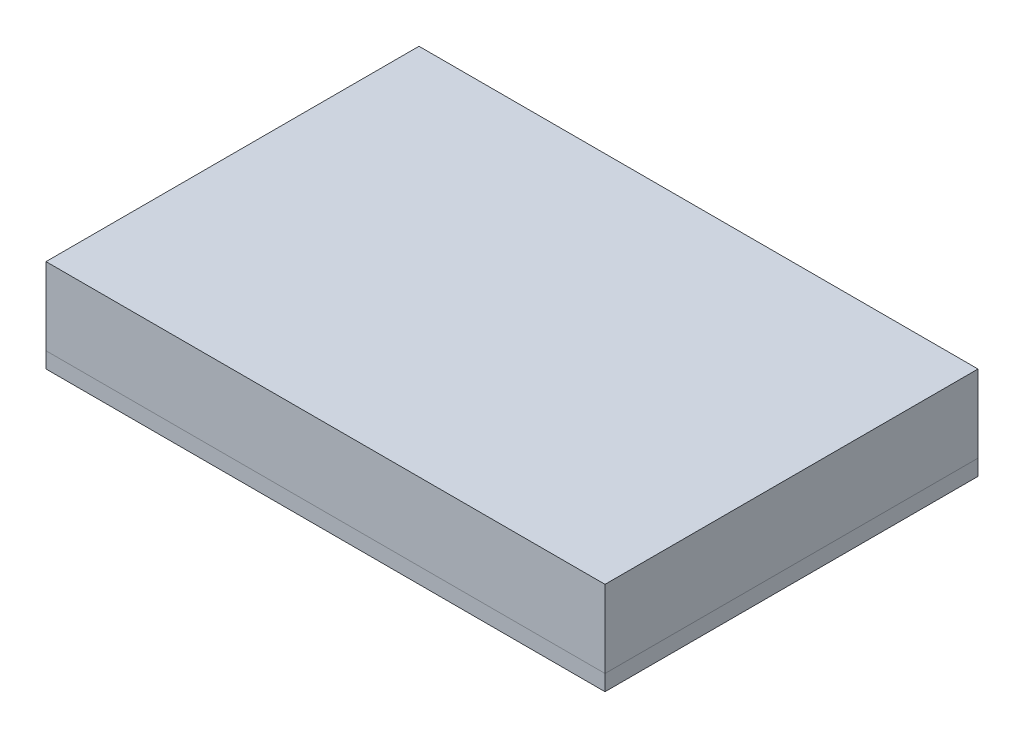
ISO-10303-21;
HEADER;
FILE_DESCRIPTION(('STEP AP214'),'2;1');
FILE_NAME('part.step','',(''),(''),'','','');
FILE_SCHEMA(('AUTOMOTIVE_DESIGN { 1 0 10303 214 1 1 1 1 }'));
ENDSEC;
DATA;
#1=APPLICATION_CONTEXT('core data for automotive mechanical design processes');
#2=APPLICATION_PROTOCOL_DEFINITION('international standard','automotive_design',2000,#1);
#3=PRODUCT_CONTEXT('',#1,'mechanical');
#4=PRODUCT('Part','Part','',(#3));
#5=PRODUCT_RELATED_PRODUCT_CATEGORY('part','',(#4));
#6=PRODUCT_DEFINITION_FORMATION('','',#4);
#7=PRODUCT_DEFINITION_CONTEXT('part definition',#1,'design');
#8=PRODUCT_DEFINITION('design','',#6,#7);
#9=PRODUCT_DEFINITION_SHAPE('','',#8);
#10=(LENGTH_UNIT() NAMED_UNIT(*) SI_UNIT(.MILLI.,.METRE.));
#11=(NAMED_UNIT(*) PLANE_ANGLE_UNIT() SI_UNIT($,.RADIAN.));
#12=(NAMED_UNIT(*) SI_UNIT($,.STERADIAN.) SOLID_ANGLE_UNIT());
#13=UNCERTAINTY_MEASURE_WITH_UNIT(LENGTH_MEASURE(1.E-05),#10,'distance_accuracy_value','');
#14=(GEOMETRIC_REPRESENTATION_CONTEXT(3) GLOBAL_UNCERTAINTY_ASSIGNED_CONTEXT((#13)) GLOBAL_UNIT_ASSIGNED_CONTEXT((#10,
#11,#12)) REPRESENTATION_CONTEXT('',''));
#15=CARTESIAN_POINT('',(0.,0.,0.));
#16=DIRECTION('',(0.,0.,1.));
#17=DIRECTION('',(1.,0.,0.));
#18=AXIS2_PLACEMENT_3D('',#15,#16,#17);
#19=CARTESIAN_POINT('',(0.,10.,-40.1));
#20=DIRECTION('',(0.,0.,1.));
#21=DIRECTION('',(1.,0.,0.));
#22=AXIS2_PLACEMENT_3D('',#19,#20,#21);
#23=PLANE('',#22);
#24=DIRECTION('',(-1.,0.,0.));
#25=VECTOR('',#24,1.);
#26=CARTESIAN_POINT('',(0.,1.7,-40.1));
#27=LINE('',#26,#25);
#28=CARTESIAN_POINT('',(60.1,1.7,-40.1));
#29=VERTEX_POINT('',#28);
#30=CARTESIAN_POINT('',(0.,1.7,-40.1));
#31=VERTEX_POINT('',#30);
#32=EDGE_CURVE('E109',#29,#31,#27,.T.);
#33=ORIENTED_EDGE('',*,*,#32,.T.);
#34=DIRECTION('',(0.,-1.,0.));
#35=VECTOR('',#34,1.);
#36=CARTESIAN_POINT('',(0.,10.,-40.1));
#37=LINE('',#36,#35);
#38=CARTESIAN_POINT('',(0.,10.,-40.1));
#39=VERTEX_POINT('',#38);
#40=EDGE_CURVE('E12',#39,#31,#37,.T.);
#41=ORIENTED_EDGE('',*,*,#40,.F.);
#42=DIRECTION('',(-1.,0.,0.));
#43=VECTOR('',#42,1.);
#44=CARTESIAN_POINT('',(0.,10.,-40.1));
#45=LINE('',#44,#43);
#46=CARTESIAN_POINT('',(60.1,10.,-40.1));
#47=VERTEX_POINT('',#46);
#48=EDGE_CURVE('E97',#47,#39,#45,.T.);
#49=ORIENTED_EDGE('',*,*,#48,.F.);
#50=DIRECTION('',(0.,-1.,0.));
#51=VECTOR('',#50,1.);
#52=CARTESIAN_POINT('',(60.1,10.,-40.1));
#53=LINE('',#52,#51);
#54=EDGE_CURVE('E105',#47,#29,#53,.T.);
#55=ORIENTED_EDGE('',*,*,#54,.T.);
#56=EDGE_LOOP('',(#33,#41,#49,#55));
#57=FACE_BOUND('',#56,.T.);
#58=ADVANCED_FACE('F46',(#57),#23,.F.);
#59=CARTESIAN_POINT('',(0.,10.,0.));
#60=DIRECTION('',(1.,0.,0.));
#61=DIRECTION('',(0.,0.,-1.));
#62=AXIS2_PLACEMENT_3D('',#59,#60,#61);
#63=PLANE('',#62);
#64=DIRECTION('',(0.,0.,1.));
#65=VECTOR('',#64,1.);
#66=CARTESIAN_POINT('',(0.,1.7,0.));
#67=LINE('',#66,#65);
#68=CARTESIAN_POINT('',(0.,1.7,0.));
#69=VERTEX_POINT('',#68);
#70=EDGE_CURVE('E101',#31,#69,#67,.T.);
#71=ORIENTED_EDGE('',*,*,#70,.T.);
#72=DIRECTION('',(0.,-1.,0.));
#73=VECTOR('',#72,1.);
#74=CARTESIAN_POINT('',(0.,10.,0.));
#75=LINE('',#74,#73);
#76=CARTESIAN_POINT('',(0.,10.,0.));
#77=VERTEX_POINT('',#76);
#78=EDGE_CURVE('E54',#77,#69,#75,.T.);
#79=ORIENTED_EDGE('',*,*,#78,.F.);
#80=DIRECTION('',(0.,0.,1.));
#81=VECTOR('',#80,1.);
#82=CARTESIAN_POINT('',(0.,10.,0.));
#83=LINE('',#82,#81);
#84=EDGE_CURVE('E92',#39,#77,#83,.T.);
#85=ORIENTED_EDGE('',*,*,#84,.F.);
#86=ORIENTED_EDGE('',*,*,#40,.T.);
#87=EDGE_LOOP('',(#71,#79,#85,#86));
#88=FACE_BOUND('',#87,.T.);
#89=ADVANCED_FACE('F100',(#88),#63,.F.);
#90=CARTESIAN_POINT('',(0.,10.,0.));
#91=DIRECTION('',(0.,0.,-1.));
#92=DIRECTION('',(-1.,0.,0.));
#93=AXIS2_PLACEMENT_3D('',#90,#91,#92);
#94=PLANE('',#93);
#95=DIRECTION('',(1.,0.,0.));
#96=VECTOR('',#95,1.);
#97=CARTESIAN_POINT('',(0.,1.7,0.));
#98=LINE('',#97,#96);
#99=CARTESIAN_POINT('',(60.1,1.7,0.));
#100=VERTEX_POINT('',#99);
#101=EDGE_CURVE('E79',#69,#100,#98,.T.);
#102=ORIENTED_EDGE('',*,*,#101,.T.);
#103=DIRECTION('',(0.,-1.,0.));
#104=VECTOR('',#103,1.);
#105=CARTESIAN_POINT('',(60.1,10.,0.));
#106=LINE('',#105,#104);
#107=CARTESIAN_POINT('',(60.1,10.,0.));
#108=VERTEX_POINT('',#107);
#109=EDGE_CURVE('E102',#108,#100,#106,.T.);
#110=ORIENTED_EDGE('',*,*,#109,.F.);
#111=DIRECTION('',(1.,0.,0.));
#112=VECTOR('',#111,1.);
#113=CARTESIAN_POINT('',(0.,10.,0.));
#114=LINE('',#113,#112);
#115=EDGE_CURVE('E95',#77,#108,#114,.T.);
#116=ORIENTED_EDGE('',*,*,#115,.F.);
#117=ORIENTED_EDGE('',*,*,#78,.T.);
#118=EDGE_LOOP('',(#102,#110,#116,#117));
#119=FACE_BOUND('',#118,.T.);
#120=ADVANCED_FACE('F103',(#119),#94,.F.);
#121=CARTESIAN_POINT('',(60.1,10.,0.));
#122=DIRECTION('',(-1.,0.,0.));
#123=DIRECTION('',(0.,0.,1.));
#124=AXIS2_PLACEMENT_3D('',#121,#122,#123);
#125=PLANE('',#124);
#126=DIRECTION('',(0.,0.,-1.));
#127=VECTOR('',#126,1.);
#128=CARTESIAN_POINT('',(60.1,1.7,0.));
#129=LINE('',#128,#127);
#130=EDGE_CURVE('E85',#100,#29,#129,.T.);
#131=ORIENTED_EDGE('',*,*,#130,.T.);
#132=ORIENTED_EDGE('',*,*,#54,.F.);
#133=DIRECTION('',(0.,0.,-1.));
#134=VECTOR('',#133,1.);
#135=CARTESIAN_POINT('',(60.1,10.,0.));
#136=LINE('',#135,#134);
#137=EDGE_CURVE('E62',#108,#47,#136,.T.);
#138=ORIENTED_EDGE('',*,*,#137,.F.);
#139=ORIENTED_EDGE('',*,*,#109,.T.);
#140=EDGE_LOOP('',(#131,#132,#138,#139));
#141=FACE_BOUND('',#140,.T.);
#142=ADVANCED_FACE('F116',(#141),#125,.F.);
#143=CARTESIAN_POINT('',(0.,10.,0.));
#144=DIRECTION('',(0.,1.,0.));
#145=DIRECTION('',(0.,0.,1.));
#146=AXIS2_PLACEMENT_3D('',#143,#144,#145);
#147=PLANE('',#146);
#148=ORIENTED_EDGE('',*,*,#48,.T.);
#149=ORIENTED_EDGE('',*,*,#84,.T.);
#150=ORIENTED_EDGE('',*,*,#115,.T.);
#151=ORIENTED_EDGE('',*,*,#137,.T.);
#152=EDGE_LOOP('',(#148,#149,#150,#151));
#153=FACE_BOUND('',#152,.T.);
#154=ADVANCED_FACE('F93',(#153),#147,.T.);
#155=CARTESIAN_POINT('',(0.,1.7,0.));
#156=DIRECTION('',(0.,1.,0.));
#157=DIRECTION('',(0.,0.,1.));
#158=AXIS2_PLACEMENT_3D('',#155,#156,#157);
#159=PLANE('',#158);
#160=ORIENTED_EDGE('',*,*,#32,.F.);
#161=ORIENTED_EDGE('',*,*,#130,.F.);
#162=ORIENTED_EDGE('',*,*,#101,.F.);
#163=ORIENTED_EDGE('',*,*,#70,.F.);
#164=EDGE_LOOP('',(#160,#161,#162,#163));
#165=FACE_BOUND('',#164,.T.);
#166=ADVANCED_FACE('F119',(#165),#159,.F.);
#167=CLOSED_SHELL('',(#58,#89,#120,#142,#154,#166));
#168=MANIFOLD_SOLID_BREP('B2',#167);
#169=CARTESIAN_POINT('',(0.,1.7,0.));
#170=DIRECTION('',(1.,0.,0.));
#171=DIRECTION('',(0.,0.,-1.));
#172=AXIS2_PLACEMENT_3D('',#169,#170,#171);
#173=PLANE('',#172);
#174=DIRECTION('',(0.,0.,1.));
#175=VECTOR('',#174,1.);
#176=CARTESIAN_POINT('',(0.,0.,0.));
#177=LINE('',#176,#175);
#178=CARTESIAN_POINT('',(0.,0.,-40.1));
#179=VERTEX_POINT('',#178);
#180=CARTESIAN_POINT('',(0.,0.,0.));
#181=VERTEX_POINT('',#180);
#182=EDGE_CURVE('E232',#179,#181,#177,.T.);
#183=ORIENTED_EDGE('',*,*,#182,.T.);
#184=DIRECTION('',(0.,-1.,0.));
#185=VECTOR('',#184,1.);
#186=CARTESIAN_POINT('',(0.,1.7,0.));
#187=LINE('',#186,#185);
#188=CARTESIAN_POINT('',(0.,1.7,0.));
#189=VERTEX_POINT('',#188);
#190=EDGE_CURVE('E44',#189,#181,#187,.T.);
#191=ORIENTED_EDGE('',*,*,#190,.F.);
#192=DIRECTION('',(0.,0.,1.));
#193=VECTOR('',#192,1.);
#194=CARTESIAN_POINT('',(0.,1.7,0.));
#195=LINE('',#194,#193);
#196=CARTESIAN_POINT('',(0.,1.7,-40.1));
#197=VERTEX_POINT('',#196);
#198=EDGE_CURVE('E220',#197,#189,#195,.T.);
#199=ORIENTED_EDGE('',*,*,#198,.F.);
#200=DIRECTION('',(0.,-1.,0.));
#201=VECTOR('',#200,1.);
#202=CARTESIAN_POINT('',(0.,1.7,-40.1));
#203=LINE('',#202,#201);
#204=EDGE_CURVE('E228',#197,#179,#203,.T.);
#205=ORIENTED_EDGE('',*,*,#204,.T.);
#206=EDGE_LOOP('',(#183,#191,#199,#205));
#207=FACE_BOUND('',#206,.T.);
#208=ADVANCED_FACE('F169',(#207),#173,.F.);
#209=CARTESIAN_POINT('',(0.,1.7,0.));
#210=DIRECTION('',(0.,0.,-1.));
#211=DIRECTION('',(-1.,0.,0.));
#212=AXIS2_PLACEMENT_3D('',#209,#210,#211);
#213=PLANE('',#212);
#214=DIRECTION('',(1.,0.,0.));
#215=VECTOR('',#214,1.);
#216=CARTESIAN_POINT('',(0.,0.,0.));
#217=LINE('',#216,#215);
#218=CARTESIAN_POINT('',(60.1,0.,0.));
#219=VERTEX_POINT('',#218);
#220=EDGE_CURVE('E224',#181,#219,#217,.T.);
#221=ORIENTED_EDGE('',*,*,#220,.T.);
#222=DIRECTION('',(0.,-1.,0.));
#223=VECTOR('',#222,1.);
#224=CARTESIAN_POINT('',(60.1,1.7,0.));
#225=LINE('',#224,#223);
#226=CARTESIAN_POINT('',(60.1,1.7,0.));
#227=VERTEX_POINT('',#226);
#228=EDGE_CURVE('E177',#227,#219,#225,.T.);
#229=ORIENTED_EDGE('',*,*,#228,.F.);
#230=DIRECTION('',(1.,0.,0.));
#231=VECTOR('',#230,1.);
#232=CARTESIAN_POINT('',(0.,1.7,0.));
#233=LINE('',#232,#231);
#234=EDGE_CURVE('E215',#189,#227,#233,.T.);
#235=ORIENTED_EDGE('',*,*,#234,.F.);
#236=ORIENTED_EDGE('',*,*,#190,.T.);
#237=EDGE_LOOP('',(#221,#229,#235,#236));
#238=FACE_BOUND('',#237,.T.);
#239=ADVANCED_FACE('F223',(#238),#213,.F.);
#240=CARTESIAN_POINT('',(60.1,1.7,0.));
#241=DIRECTION('',(-1.,0.,0.));
#242=DIRECTION('',(0.,0.,1.));
#243=AXIS2_PLACEMENT_3D('',#240,#241,#242);
#244=PLANE('',#243);
#245=DIRECTION('',(0.,0.,-1.));
#246=VECTOR('',#245,1.);
#247=CARTESIAN_POINT('',(60.1,0.,0.));
#248=LINE('',#247,#246);
#249=CARTESIAN_POINT('',(60.1,0.,-40.1));
#250=VERTEX_POINT('',#249);
#251=EDGE_CURVE('E202',#219,#250,#248,.T.);
#252=ORIENTED_EDGE('',*,*,#251,.T.);
#253=DIRECTION('',(0.,-1.,0.));
#254=VECTOR('',#253,1.);
#255=CARTESIAN_POINT('',(60.1,1.7,-40.1));
#256=LINE('',#255,#254);
#257=CARTESIAN_POINT('',(60.1,1.7,-40.1));
#258=VERTEX_POINT('',#257);
#259=EDGE_CURVE('E225',#258,#250,#256,.T.);
#260=ORIENTED_EDGE('',*,*,#259,.F.);
#261=DIRECTION('',(0.,0.,-1.));
#262=VECTOR('',#261,1.);
#263=CARTESIAN_POINT('',(60.1,1.7,0.));
#264=LINE('',#263,#262);
#265=EDGE_CURVE('E218',#227,#258,#264,.T.);
#266=ORIENTED_EDGE('',*,*,#265,.F.);
#267=ORIENTED_EDGE('',*,*,#228,.T.);
#268=EDGE_LOOP('',(#252,#260,#266,#267));
#269=FACE_BOUND('',#268,.T.);
#270=ADVANCED_FACE('F226',(#269),#244,.F.);
#271=CARTESIAN_POINT('',(0.,1.7,-40.1));
#272=DIRECTION('',(0.,0.,1.));
#273=DIRECTION('',(1.,0.,0.));
#274=AXIS2_PLACEMENT_3D('',#271,#272,#273);
#275=PLANE('',#274);
#276=DIRECTION('',(-1.,0.,0.));
#277=VECTOR('',#276,1.);
#278=CARTESIAN_POINT('',(0.,0.,-40.1));
#279=LINE('',#278,#277);
#280=EDGE_CURVE('E208',#250,#179,#279,.T.);
#281=ORIENTED_EDGE('',*,*,#280,.T.);
#282=ORIENTED_EDGE('',*,*,#204,.F.);
#283=DIRECTION('',(-1.,0.,0.));
#284=VECTOR('',#283,1.);
#285=CARTESIAN_POINT('',(0.,1.7,-40.1));
#286=LINE('',#285,#284);
#287=EDGE_CURVE('E185',#258,#197,#286,.T.);
#288=ORIENTED_EDGE('',*,*,#287,.F.);
#289=ORIENTED_EDGE('',*,*,#259,.T.);
#290=EDGE_LOOP('',(#281,#282,#288,#289));
#291=FACE_BOUND('',#290,.T.);
#292=ADVANCED_FACE('F239',(#291),#275,.F.);
#293=CARTESIAN_POINT('',(0.,1.7,0.));
#294=DIRECTION('',(0.,-1.,0.));
#295=DIRECTION('',(0.,0.,-1.));
#296=AXIS2_PLACEMENT_3D('',#293,#294,#295);
#297=PLANE('',#296);
#298=ORIENTED_EDGE('',*,*,#198,.T.);
#299=ORIENTED_EDGE('',*,*,#234,.T.);
#300=ORIENTED_EDGE('',*,*,#265,.T.);
#301=ORIENTED_EDGE('',*,*,#287,.T.);
#302=EDGE_LOOP('',(#298,#299,#300,#301));
#303=FACE_BOUND('',#302,.T.);
#304=ADVANCED_FACE('F216',(#303),#297,.F.);
#305=CARTESIAN_POINT('',(0.,0.,0.));
#306=DIRECTION('',(0.,-1.,0.));
#307=DIRECTION('',(0.,0.,-1.));
#308=AXIS2_PLACEMENT_3D('',#305,#306,#307);
#309=PLANE('',#308);
#310=ORIENTED_EDGE('',*,*,#182,.F.);
#311=ORIENTED_EDGE('',*,*,#280,.F.);
#312=ORIENTED_EDGE('',*,*,#251,.F.);
#313=ORIENTED_EDGE('',*,*,#220,.F.);
#314=EDGE_LOOP('',(#310,#311,#312,#313));
#315=FACE_BOUND('',#314,.T.);
#316=ADVANCED_FACE('F242',(#315),#309,.T.);
#317=CLOSED_SHELL('',(#208,#239,#270,#292,#304,#316));
#318=MANIFOLD_SOLID_BREP('B6',#317);
#319=ADVANCED_BREP_SHAPE_REPRESENTATION('',(#18,#168,#318),#14);
#320=SHAPE_DEFINITION_REPRESENTATION(#9,#319);
ENDSEC;
END-ISO-10303-21;
